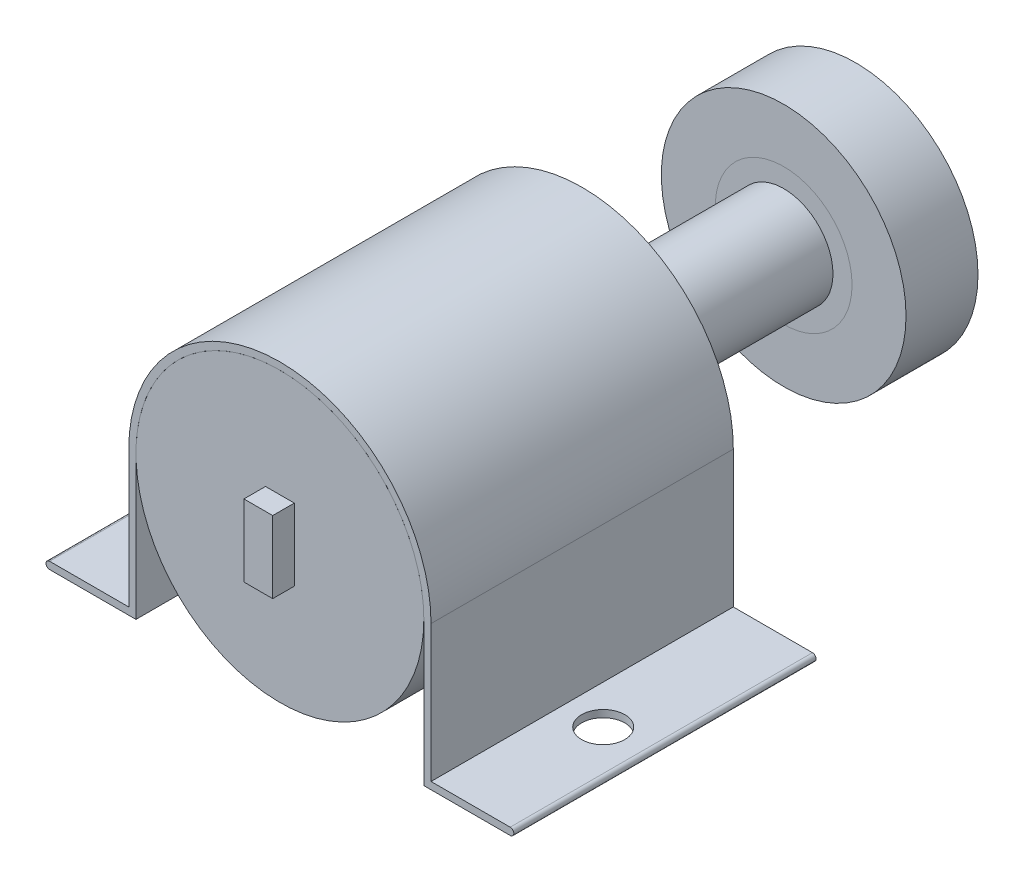
ISO-10303-21;
HEADER;
FILE_DESCRIPTION(('STEP AP214'),'2;1');
FILE_NAME('part.step','',(''),(''),'','','');
FILE_SCHEMA(('AUTOMOTIVE_DESIGN { 1 0 10303 214 1 1 1 1 }'));
ENDSEC;
DATA;
#1=APPLICATION_CONTEXT('core data for automotive mechanical design processes');
#2=APPLICATION_PROTOCOL_DEFINITION('international standard','automotive_design',2000,#1);
#3=PRODUCT_CONTEXT('',#1,'mechanical');
#4=PRODUCT('Part','Part','',(#3));
#5=PRODUCT_RELATED_PRODUCT_CATEGORY('part','',(#4));
#6=PRODUCT_DEFINITION_FORMATION('','',#4);
#7=PRODUCT_DEFINITION_CONTEXT('part definition',#1,'design');
#8=PRODUCT_DEFINITION('design','',#6,#7);
#9=PRODUCT_DEFINITION_SHAPE('','',#8);
#10=(LENGTH_UNIT() NAMED_UNIT(*) SI_UNIT(.MILLI.,.METRE.));
#11=(NAMED_UNIT(*) PLANE_ANGLE_UNIT() SI_UNIT($,.RADIAN.));
#12=(NAMED_UNIT(*) SI_UNIT($,.STERADIAN.) SOLID_ANGLE_UNIT());
#13=UNCERTAINTY_MEASURE_WITH_UNIT(LENGTH_MEASURE(1.E-05),#10,'distance_accuracy_value','');
#14=(GEOMETRIC_REPRESENTATION_CONTEXT(3) GLOBAL_UNCERTAINTY_ASSIGNED_CONTEXT((#13)) GLOBAL_UNIT_ASSIGNED_CONTEXT((#10,
#11,#12)) REPRESENTATION_CONTEXT('',''));
#15=CARTESIAN_POINT('',(0.,0.,0.));
#16=DIRECTION('',(0.,0.,1.));
#17=DIRECTION('',(1.,0.,0.));
#18=AXIS2_PLACEMENT_3D('',#15,#16,#17);
#19=CARTESIAN_POINT('',(0.,52.,-248.));
#20=DIRECTION('',(0.,0.,-1.));
#21=DIRECTION('',(-1.,0.,0.));
#22=AXIS2_PLACEMENT_3D('',#19,#20,#21);
#23=PLANE('',#22);
#24=DIRECTION('',(0.,-1.,0.));
#25=VECTOR('',#24,1.);
#26=CARTESIAN_POINT('',(1.99999999999989,49.5,-248.));
#27=LINE('',#26,#25);
#28=CARTESIAN_POINT('',(1.99999999999989,56.9999999999991,-248.));
#29=VERTEX_POINT('',#28);
#30=CARTESIAN_POINT('',(1.99999999999989,46.9999999999991,-248.));
#31=VERTEX_POINT('',#30);
#32=EDGE_CURVE('P0_E131',#29,#31,#27,.T.);
#33=ORIENTED_EDGE('',*,*,#32,.T.);
#34=DIRECTION('',(-1.,0.,0.));
#35=VECTOR('',#34,1.);
#36=CARTESIAN_POINT('',(-1.00000000000023,46.9999999999991,-248.));
#37=LINE('',#36,#35);
#38=CARTESIAN_POINT('',(-2.00000000000017,46.9999999999991,-248.));
#39=VERTEX_POINT('',#38);
#40=EDGE_CURVE('P0_E114',#31,#39,#37,.T.);
#41=ORIENTED_EDGE('',*,*,#40,.T.);
#42=DIRECTION('',(0.,1.,0.));
#43=VECTOR('',#42,1.);
#44=CARTESIAN_POINT('',(-2.00000000000046,54.5,-248.));
#45=LINE('',#44,#43);
#46=CARTESIAN_POINT('',(-2.00000000000017,56.9999999999991,-248.));
#47=VERTEX_POINT('',#46);
#48=EDGE_CURVE('P0_E140',#39,#47,#45,.T.);
#49=ORIENTED_EDGE('',*,*,#48,.T.);
#50=DIRECTION('',(1.,0.,0.));
#51=VECTOR('',#50,1.);
#52=CARTESIAN_POINT('',(0.999999999999942,56.9999999999991,-248.));
#53=LINE('',#52,#51);
#54=EDGE_CURVE('P0_E75',#47,#29,#53,.T.);
#55=ORIENTED_EDGE('',*,*,#54,.T.);
#56=EDGE_LOOP('',(#33,#41,#49,#55));
#57=FACE_BOUND('',#56,.T.);
#58=CARTESIAN_POINT('',(0.,52.,-248.));
#59=DIRECTION('',(0.,0.,-1.));
#60=DIRECTION('',(-1.,0.,0.));
#61=AXIS2_PLACEMENT_3D('',#58,#59,#60);
#62=CIRCLE('',#61,20.);
#63=CARTESIAN_POINT('',(20.,52.,-248.));
#64=VERTEX_POINT('',#63);
#65=EDGE_CURVE('P0_E11',#64,#64,#62,.T.);
#66=ORIENTED_EDGE('',*,*,#65,.F.);
#67=EDGE_LOOP('',(#66));
#68=FACE_BOUND('',#67,.T.);
#69=ADVANCED_FACE('P0_F17',(#57,#68),#23,.F.);
#70=CARTESIAN_POINT('',(0.,52.,-288.));
#71=DIRECTION('',(0.,0.,-1.));
#72=DIRECTION('',(-1.,0.,0.));
#73=AXIS2_PLACEMENT_3D('',#70,#71,#72);
#74=PLANE('',#73);
#75=CARTESIAN_POINT('',(0.,52.,-288.));
#76=DIRECTION('',(0.,0.,1.));
#77=DIRECTION('',(-1.,0.,0.));
#78=AXIS2_PLACEMENT_3D('',#75,#76,#77);
#79=CIRCLE('',#78,6.85);
#80=CARTESIAN_POINT('',(6.85,52.,-288.));
#81=VERTEX_POINT('',#80);
#82=EDGE_CURVE('P0_E141',#81,#81,#79,.T.);
#83=ORIENTED_EDGE('',*,*,#82,.T.);
#84=EDGE_LOOP('',(#83));
#85=FACE_BOUND('',#84,.T.);
#86=CARTESIAN_POINT('',(0.,52.,-288.));
#87=DIRECTION('',(0.,0.,-1.));
#88=DIRECTION('',(-1.,0.,0.));
#89=AXIS2_PLACEMENT_3D('',#86,#87,#88);
#90=CIRCLE('',#89,20.);
#91=CARTESIAN_POINT('',(20.,52.,-288.));
#92=VERTEX_POINT('',#91);
#93=EDGE_CURVE('P0_E144',#92,#92,#90,.T.);
#94=ORIENTED_EDGE('',*,*,#93,.T.);
#95=EDGE_LOOP('',(#94));
#96=FACE_BOUND('',#95,.T.);
#97=ADVANCED_FACE('P0_F157',(#85,#96),#74,.T.);
#98=CARTESIAN_POINT('',(0.,52.,-248.));
#99=DIRECTION('',(0.,0.,-1.));
#100=DIRECTION('',(-1.,0.,0.));
#101=AXIS2_PLACEMENT_3D('',#98,#99,#100);
#102=CYLINDRICAL_SURFACE('',#101,20.);
#103=ORIENTED_EDGE('',*,*,#93,.F.);
#104=DIRECTION('',(0.,0.,1.));
#105=VECTOR('',#104,1.);
#106=CARTESIAN_POINT('',(20.,52.,-248.));
#107=LINE('',#106,#105);
#108=EDGE_CURVE('P0_E26',#92,#64,#107,.T.);
#109=ORIENTED_EDGE('',*,*,#108,.T.);
#110=ORIENTED_EDGE('',*,*,#65,.T.);
#111=ORIENTED_EDGE('',*,*,#108,.F.);
#112=EDGE_LOOP('',(#103,#109,#110,#111));
#113=FACE_BOUND('',#112,.T.);
#114=ADVANCED_FACE('P0_F19',(#113),#102,.T.);
#115=CARTESIAN_POINT('',(0.,52.,-328.));
#116=DIRECTION('',(0.,0.,-1.));
#117=DIRECTION('',(-1.,0.,0.));
#118=AXIS2_PLACEMENT_3D('',#115,#116,#117);
#119=PLANE('',#118);
#120=CARTESIAN_POINT('',(0.,52.,-328.));
#121=DIRECTION('',(0.,0.,-1.));
#122=DIRECTION('',(-1.,0.,0.));
#123=AXIS2_PLACEMENT_3D('',#120,#121,#122);
#124=CIRCLE('',#123,9.5);
#125=CARTESIAN_POINT('',(9.5,52.,-328.));
#126=VERTEX_POINT('',#125);
#127=EDGE_CURVE('P0_E199',#126,#126,#124,.T.);
#128=ORIENTED_EDGE('',*,*,#127,.T.);
#129=EDGE_LOOP('',(#128));
#130=FACE_BOUND('',#129,.T.);
#131=ADVANCED_FACE('P0_F166',(#130),#119,.T.);
#132=CARTESIAN_POINT('',(0.,52.,-288.));
#133=DIRECTION('',(0.,0.,-1.));
#134=DIRECTION('',(-1.,0.,0.));
#135=AXIS2_PLACEMENT_3D('',#132,#133,#134);
#136=CYLINDRICAL_SURFACE('',#135,6.85);
#137=CARTESIAN_POINT('',(0.,52.,-318.));
#138=DIRECTION('',(0.,0.,1.));
#139=DIRECTION('',(-1.,0.,0.));
#140=AXIS2_PLACEMENT_3D('',#137,#138,#139);
#141=CIRCLE('',#140,6.85);
#142=CARTESIAN_POINT('',(6.85000000000009,52.,-318.));
#143=VERTEX_POINT('',#142);
#144=EDGE_CURVE('P0_E202',#143,#143,#141,.T.);
#145=ORIENTED_EDGE('',*,*,#144,.T.);
#146=DIRECTION('',(0.,0.,1.));
#147=VECTOR('',#146,1.);
#148=CARTESIAN_POINT('',(6.85,52.,-288.));
#149=LINE('',#148,#147);
#150=EDGE_CURVE('P0_E145',#143,#81,#149,.T.);
#151=ORIENTED_EDGE('',*,*,#150,.T.);
#152=ORIENTED_EDGE('',*,*,#82,.F.);
#153=ORIENTED_EDGE('',*,*,#150,.F.);
#154=EDGE_LOOP('',(#145,#151,#152,#153));
#155=FACE_BOUND('',#154,.T.);
#156=ADVANCED_FACE('P0_F186',(#155),#136,.T.);
#157=CARTESIAN_POINT('',(0.,51.9999999999991,-245.));
#158=DIRECTION('',(0.,0.,1.));
#159=DIRECTION('',(1.,0.,0.));
#160=AXIS2_PLACEMENT_3D('',#157,#158,#159);
#161=PLANE('',#160);
#162=DIRECTION('',(-1.,0.,0.));
#163=VECTOR('',#162,1.);
#164=CARTESIAN_POINT('',(-2.00000000000017,56.9999999999991,-245.));
#165=LINE('',#164,#163);
#166=CARTESIAN_POINT('',(1.99999999999989,56.9999999999991,-245.));
#167=VERTEX_POINT('',#166);
#168=CARTESIAN_POINT('',(-2.00000000000017,56.9999999999991,-245.));
#169=VERTEX_POINT('',#168);
#170=EDGE_CURVE('P0_E100',#167,#169,#165,.T.);
#171=ORIENTED_EDGE('',*,*,#170,.T.);
#172=DIRECTION('',(0.,-1.,0.));
#173=VECTOR('',#172,1.);
#174=CARTESIAN_POINT('',(-2.00000000000017,46.9999999999991,-245.));
#175=LINE('',#174,#173);
#176=CARTESIAN_POINT('',(-2.00000000000017,46.9999999999991,-245.));
#177=VERTEX_POINT('',#176);
#178=EDGE_CURVE('P0_E63',#169,#177,#175,.T.);
#179=ORIENTED_EDGE('',*,*,#178,.T.);
#180=DIRECTION('',(1.,0.,0.));
#181=VECTOR('',#180,1.);
#182=CARTESIAN_POINT('',(1.99999999999989,46.9999999999991,-245.));
#183=LINE('',#182,#181);
#184=CARTESIAN_POINT('',(1.99999999999989,46.9999999999991,-245.));
#185=VERTEX_POINT('',#184);
#186=EDGE_CURVE('P0_E104',#177,#185,#183,.T.);
#187=ORIENTED_EDGE('',*,*,#186,.T.);
#188=DIRECTION('',(0.,1.,0.));
#189=VECTOR('',#188,1.);
#190=CARTESIAN_POINT('',(1.99999999999989,56.9999999999991,-245.));
#191=LINE('',#190,#189);
#192=EDGE_CURVE('P0_E108',#185,#167,#191,.T.);
#193=ORIENTED_EDGE('',*,*,#192,.T.);
#194=EDGE_LOOP('',(#171,#179,#187,#193));
#195=FACE_BOUND('',#194,.T.);
#196=ADVANCED_FACE('P0_F106',(#195),#161,.T.);
#197=CARTESIAN_POINT('',(1.99999999999989,56.9999999999991,-248.));
#198=DIRECTION('',(0.,1.,0.));
#199=DIRECTION('',(1.,0.,0.));
#200=AXIS2_PLACEMENT_3D('',#197,#198,#199);
#201=PLANE('',#200);
#202=ORIENTED_EDGE('',*,*,#54,.F.);
#203=DIRECTION('',(0.,0.,1.));
#204=VECTOR('',#203,1.);
#205=CARTESIAN_POINT('',(-2.00000000000017,56.9999999999991,-248.));
#206=LINE('',#205,#204);
#207=EDGE_CURVE('P0_E136',#47,#169,#206,.T.);
#208=ORIENTED_EDGE('',*,*,#207,.T.);
#209=ORIENTED_EDGE('',*,*,#170,.F.);
#210=DIRECTION('',(0.,0.,1.));
#211=VECTOR('',#210,1.);
#212=CARTESIAN_POINT('',(1.99999999999989,56.9999999999991,-248.));
#213=LINE('',#212,#211);
#214=EDGE_CURVE('P0_E126',#29,#167,#213,.T.);
#215=ORIENTED_EDGE('',*,*,#214,.F.);
#216=EDGE_LOOP('',(#202,#208,#209,#215));
#217=FACE_BOUND('',#216,.T.);
#218=ADVANCED_FACE('P0_F170',(#217),#201,.T.);
#219=CARTESIAN_POINT('',(-2.00000000000017,56.9999999999991,-248.));
#220=DIRECTION('',(-1.,0.,0.));
#221=DIRECTION('',(0.,1.,0.));
#222=AXIS2_PLACEMENT_3D('',#219,#220,#221);
#223=PLANE('',#222);
#224=ORIENTED_EDGE('',*,*,#48,.F.);
#225=DIRECTION('',(0.,0.,1.));
#226=VECTOR('',#225,1.);
#227=CARTESIAN_POINT('',(-2.00000000000017,46.9999999999991,-248.));
#228=LINE('',#227,#226);
#229=EDGE_CURVE('P0_E113',#39,#177,#228,.T.);
#230=ORIENTED_EDGE('',*,*,#229,.T.);
#231=ORIENTED_EDGE('',*,*,#178,.F.);
#232=ORIENTED_EDGE('',*,*,#207,.F.);
#233=EDGE_LOOP('',(#224,#230,#231,#232));
#234=FACE_BOUND('',#233,.T.);
#235=ADVANCED_FACE('P0_F173',(#234),#223,.T.);
#236=CARTESIAN_POINT('',(-2.00000000000017,46.9999999999991,-248.));
#237=DIRECTION('',(0.,-1.,0.));
#238=DIRECTION('',(-1.,0.,0.));
#239=AXIS2_PLACEMENT_3D('',#236,#237,#238);
#240=PLANE('',#239);
#241=ORIENTED_EDGE('',*,*,#40,.F.);
#242=DIRECTION('',(0.,0.,1.));
#243=VECTOR('',#242,1.);
#244=CARTESIAN_POINT('',(1.99999999999989,46.9999999999991,-248.));
#245=LINE('',#244,#243);
#246=EDGE_CURVE('P0_E117',#31,#185,#245,.T.);
#247=ORIENTED_EDGE('',*,*,#246,.T.);
#248=ORIENTED_EDGE('',*,*,#186,.F.);
#249=ORIENTED_EDGE('',*,*,#229,.F.);
#250=EDGE_LOOP('',(#241,#247,#248,#249));
#251=FACE_BOUND('',#250,.T.);
#252=ADVANCED_FACE('P0_F118',(#251),#240,.T.);
#253=CARTESIAN_POINT('',(1.99999999999989,46.9999999999991,-248.));
#254=DIRECTION('',(1.,0.,0.));
#255=DIRECTION('',(0.,0.,-1.));
#256=AXIS2_PLACEMENT_3D('',#253,#254,#255);
#257=PLANE('',#256);
#258=ORIENTED_EDGE('',*,*,#32,.F.);
#259=ORIENTED_EDGE('',*,*,#214,.T.);
#260=ORIENTED_EDGE('',*,*,#192,.F.);
#261=ORIENTED_EDGE('',*,*,#246,.F.);
#262=EDGE_LOOP('',(#258,#259,#260,#261));
#263=FACE_BOUND('',#262,.T.);
#264=ADVANCED_FACE('P0_F125',(#263),#257,.T.);
#265=CARTESIAN_POINT('',(0.,52.,-318.));
#266=DIRECTION('',(0.,0.,-1.));
#267=DIRECTION('',(0.,-1.,0.));
#268=AXIS2_PLACEMENT_3D('',#265,#266,#267);
#269=PLANE('',#268);
#270=ORIENTED_EDGE('',*,*,#144,.F.);
#271=EDGE_LOOP('',(#270));
#272=FACE_BOUND('',#271,.T.);
#273=CARTESIAN_POINT('',(0.,52.,-318.));
#274=DIRECTION('',(0.,0.,1.));
#275=DIRECTION('',(-1.,0.,0.));
#276=AXIS2_PLACEMENT_3D('',#273,#274,#275);
#277=CIRCLE('',#276,9.5);
#278=CARTESIAN_POINT('',(9.5,52.,-318.));
#279=VERTEX_POINT('',#278);
#280=EDGE_CURVE('P0_E211',#279,#279,#277,.T.);
#281=ORIENTED_EDGE('',*,*,#280,.T.);
#282=EDGE_LOOP('',(#281));
#283=FACE_BOUND('',#282,.T.);
#284=ADVANCED_FACE('P0_F176',(#272,#283),#269,.F.);
#285=CARTESIAN_POINT('',(0.,52.,-328.));
#286=DIRECTION('',(0.,0.,1.));
#287=DIRECTION('',(-1.,0.,0.));
#288=AXIS2_PLACEMENT_3D('',#285,#286,#287);
#289=CYLINDRICAL_SURFACE('',#288,9.5);
#290=ORIENTED_EDGE('',*,*,#280,.F.);
#291=DIRECTION('',(0.,0.,-1.));
#292=VECTOR('',#291,1.);
#293=CARTESIAN_POINT('',(9.5,52.,-328.));
#294=LINE('',#293,#292);
#295=EDGE_CURVE('P0_E203',#279,#126,#294,.T.);
#296=ORIENTED_EDGE('',*,*,#295,.T.);
#297=ORIENTED_EDGE('',*,*,#127,.F.);
#298=ORIENTED_EDGE('',*,*,#295,.F.);
#299=EDGE_LOOP('',(#290,#296,#297,#298));
#300=FACE_BOUND('',#299,.T.);
#301=ADVANCED_FACE('P0_F174',(#300),#289,.T.);
#302=CLOSED_SHELL('',(#69,#97,#114,#131,#156,#196,#218,#235,#252,#264,#284,#301));
#303=MANIFOLD_SOLID_BREP('P0_B1',#302);
#304=CARTESIAN_POINT('',(1.43662859386495E-13,52.,-318.));
#305=DIRECTION('',(0.,0.,-1.));
#306=DIRECTION('',(0.,-1.,0.));
#307=AXIS2_PLACEMENT_3D('',#304,#305,#306);
#308=PLANE('',#307);
#309=CARTESIAN_POINT('',(1.43662859386495E-13,52.,-318.));
#310=DIRECTION('',(0.,0.,-1.));
#311=DIRECTION('',(-1.,0.,0.));
#312=AXIS2_PLACEMENT_3D('',#309,#310,#311);
#313=CIRCLE('',#312,9.5);
#314=CARTESIAN_POINT('',(9.50000000000015,52.,-318.));
#315=VERTEX_POINT('',#314);
#316=EDGE_CURVE('P1_E57',#315,#315,#313,.T.);
#317=ORIENTED_EDGE('',*,*,#316,.T.);
#318=EDGE_LOOP('',(#317));
#319=FACE_BOUND('',#318,.T.);
#320=CARTESIAN_POINT('',(1.43662859386495E-13,52.,-318.));
#321=DIRECTION('',(0.,0.,1.));
#322=DIRECTION('',(-1.,0.,0.));
#323=AXIS2_PLACEMENT_3D('',#320,#321,#322);
#324=CIRCLE('',#323,17.0000000646859);
#325=CARTESIAN_POINT('',(17.0000000646861,52.,-318.));
#326=VERTEX_POINT('',#325);
#327=EDGE_CURVE('P1_E67',#326,#326,#324,.T.);
#328=ORIENTED_EDGE('',*,*,#327,.T.);
#329=EDGE_LOOP('',(#328));
#330=FACE_BOUND('',#329,.T.);
#331=ADVANCED_FACE('P1_F17',(#319,#330),#308,.F.);
#332=CARTESIAN_POINT('',(1.43662859386495E-13,52.,-328.));
#333=DIRECTION('',(0.,0.,-1.));
#334=DIRECTION('',(0.,-1.,0.));
#335=AXIS2_PLACEMENT_3D('',#332,#333,#334);
#336=PLANE('',#335);
#337=CARTESIAN_POINT('',(1.43662859386495E-13,52.,-328.));
#338=DIRECTION('',(0.,0.,1.));
#339=DIRECTION('',(-1.,0.,0.));
#340=AXIS2_PLACEMENT_3D('',#337,#338,#339);
#341=CIRCLE('',#340,9.5);
#342=CARTESIAN_POINT('',(9.50000000000015,52.,-328.));
#343=VERTEX_POINT('',#342);
#344=EDGE_CURVE('P1_E56',#343,#343,#341,.T.);
#345=ORIENTED_EDGE('',*,*,#344,.T.);
#346=EDGE_LOOP('',(#345));
#347=FACE_BOUND('',#346,.T.);
#348=CARTESIAN_POINT('',(1.43662859386495E-13,52.,-328.));
#349=DIRECTION('',(0.,0.,-1.));
#350=DIRECTION('',(-1.,0.,0.));
#351=AXIS2_PLACEMENT_3D('',#348,#349,#350);
#352=CIRCLE('',#351,17.0000000646859);
#353=CARTESIAN_POINT('',(17.0000000646861,52.,-328.));
#354=VERTEX_POINT('',#353);
#355=EDGE_CURVE('P1_E11',#354,#354,#352,.T.);
#356=ORIENTED_EDGE('',*,*,#355,.T.);
#357=EDGE_LOOP('',(#356));
#358=FACE_BOUND('',#357,.T.);
#359=ADVANCED_FACE('P1_F61',(#347,#358),#336,.T.);
#360=CARTESIAN_POINT('',(1.43662859386495E-13,52.,-328.));
#361=DIRECTION('',(0.,0.,1.));
#362=DIRECTION('',(-1.,0.,0.));
#363=AXIS2_PLACEMENT_3D('',#360,#361,#362);
#364=CYLINDRICAL_SURFACE('',#363,17.0000000646859);
#365=ORIENTED_EDGE('',*,*,#327,.F.);
#366=DIRECTION('',(0.,0.,-1.));
#367=VECTOR('',#366,1.);
#368=CARTESIAN_POINT('',(17.000000064686,52.,-328.));
#369=LINE('',#368,#367);
#370=EDGE_CURVE('P1_E25',#326,#354,#369,.T.);
#371=ORIENTED_EDGE('',*,*,#370,.T.);
#372=ORIENTED_EDGE('',*,*,#355,.F.);
#373=ORIENTED_EDGE('',*,*,#370,.F.);
#374=EDGE_LOOP('',(#365,#371,#372,#373));
#375=FACE_BOUND('',#374,.T.);
#376=ADVANCED_FACE('P1_F74',(#375),#364,.T.);
#377=CARTESIAN_POINT('',(1.43662859386495E-13,52.,-328.));
#378=DIRECTION('',(0.,0.,1.));
#379=DIRECTION('',(-1.,0.,0.));
#380=AXIS2_PLACEMENT_3D('',#377,#378,#379);
#381=CYLINDRICAL_SURFACE('',#380,9.5);
#382=ORIENTED_EDGE('',*,*,#344,.F.);
#383=DIRECTION('',(0.,0.,1.));
#384=VECTOR('',#383,1.);
#385=CARTESIAN_POINT('',(9.50000000000014,52.,-328.));
#386=LINE('',#385,#384);
#387=EDGE_CURVE('P1_E53',#343,#315,#386,.T.);
#388=ORIENTED_EDGE('',*,*,#387,.T.);
#389=ORIENTED_EDGE('',*,*,#316,.F.);
#390=ORIENTED_EDGE('',*,*,#387,.F.);
#391=EDGE_LOOP('',(#382,#388,#389,#390));
#392=FACE_BOUND('',#391,.T.);
#393=ADVANCED_FACE('P1_F55',(#392),#381,.F.);
#394=CLOSED_SHELL('',(#331,#359,#376,#393));
#395=MANIFOLD_SOLID_BREP('P1_B1',#394);
#396=CARTESIAN_POINT('',(0.,52.5,-290.));
#397=DIRECTION('',(0.,0.,1.));
#398=DIRECTION('',(1.,0.,0.));
#399=AXIS2_PLACEMENT_3D('',#396,#397,#398);
#400=PLANE('',#399);
#401=DIRECTION('',(-1.,0.,0.));
#402=VECTOR('',#401,1.);
#403=CARTESIAN_POINT('',(20.,32.,-290.));
#404=LINE('',#403,#402);
#405=CARTESIAN_POINT('',(32.,32.,-290.));
#406=VERTEX_POINT('',#405);
#407=CARTESIAN_POINT('',(20.,32.,-290.));
#408=VERTEX_POINT('',#407);
#409=EDGE_CURVE('P2_E11',#406,#408,#404,.T.);
#410=ORIENTED_EDGE('',*,*,#409,.T.);
#411=DIRECTION('',(0.,1.,0.));
#412=VECTOR('',#411,1.);
#413=CARTESIAN_POINT('',(20.,52.,-290.));
#414=LINE('',#413,#412);
#415=CARTESIAN_POINT('',(20.,52.,-290.));
#416=VERTEX_POINT('',#415);
#417=EDGE_CURVE('P2_E282',#408,#416,#414,.T.);
#418=ORIENTED_EDGE('',*,*,#417,.T.);
#419=CARTESIAN_POINT('',(0.,52.,-290.));
#420=DIRECTION('',(0.,0.,1.));
#421=DIRECTION('',(0.,1.,0.));
#422=AXIS2_PLACEMENT_3D('',#419,#420,#421);
#423=CIRCLE('',#422,20.);
#424=CARTESIAN_POINT('',(-20.,52.,-290.));
#425=VERTEX_POINT('',#424);
#426=EDGE_CURVE('P2_E224',#416,#425,#423,.T.);
#427=ORIENTED_EDGE('',*,*,#426,.T.);
#428=DIRECTION('',(0.,-1.,0.));
#429=VECTOR('',#428,1.);
#430=CARTESIAN_POINT('',(-20.,52.,-290.));
#431=LINE('',#430,#429);
#432=CARTESIAN_POINT('',(-20.,32.,-290.));
#433=VERTEX_POINT('',#432);
#434=EDGE_CURVE('P2_E273',#425,#433,#431,.T.);
#435=ORIENTED_EDGE('',*,*,#434,.T.);
#436=DIRECTION('',(-1.,0.,0.));
#437=VECTOR('',#436,1.);
#438=CARTESIAN_POINT('',(-20.,32.,-290.));
#439=LINE('',#438,#437);
#440=CARTESIAN_POINT('',(-32.,32.,-290.));
#441=VERTEX_POINT('',#440);
#442=EDGE_CURVE('P2_E243',#433,#441,#439,.T.);
#443=ORIENTED_EDGE('',*,*,#442,.T.);
#444=CARTESIAN_POINT('',(-32.,32.5,-290.));
#445=DIRECTION('',(0.,0.,-1.));
#446=DIRECTION('',(0.,1.,0.));
#447=AXIS2_PLACEMENT_3D('',#444,#445,#446);
#448=CIRCLE('',#447,0.5);
#449=CARTESIAN_POINT('',(-32.,33.,-290.));
#450=VERTEX_POINT('',#449);
#451=EDGE_CURVE('P2_E259',#441,#450,#448,.T.);
#452=ORIENTED_EDGE('',*,*,#451,.T.);
#453=DIRECTION('',(1.,0.,0.));
#454=VECTOR('',#453,1.);
#455=CARTESIAN_POINT('',(-21.,33.,-290.));
#456=LINE('',#455,#454);
#457=CARTESIAN_POINT('',(-21.,33.,-290.));
#458=VERTEX_POINT('',#457);
#459=EDGE_CURVE('P2_E248',#450,#458,#456,.T.);
#460=ORIENTED_EDGE('',*,*,#459,.T.);
#461=DIRECTION('',(0.,1.,0.));
#462=VECTOR('',#461,1.);
#463=CARTESIAN_POINT('',(-21.,52.,-290.));
#464=LINE('',#463,#462);
#465=CARTESIAN_POINT('',(-21.,52.,-290.));
#466=VERTEX_POINT('',#465);
#467=EDGE_CURVE('P2_E232',#458,#466,#464,.T.);
#468=ORIENTED_EDGE('',*,*,#467,.T.);
#469=CARTESIAN_POINT('',(0.,52.,-290.));
#470=DIRECTION('',(0.,0.,-1.));
#471=DIRECTION('',(1.,0.,0.));
#472=AXIS2_PLACEMENT_3D('',#469,#470,#471);
#473=CIRCLE('',#472,21.);
#474=CARTESIAN_POINT('',(21.,52.,-290.));
#475=VERTEX_POINT('',#474);
#476=EDGE_CURVE('P2_E211',#466,#475,#473,.T.);
#477=ORIENTED_EDGE('',*,*,#476,.T.);
#478=DIRECTION('',(0.,-1.,0.));
#479=VECTOR('',#478,1.);
#480=CARTESIAN_POINT('',(21.,52.,-290.));
#481=LINE('',#480,#479);
#482=CARTESIAN_POINT('',(21.,33.,-290.));
#483=VERTEX_POINT('',#482);
#484=EDGE_CURVE('P2_E197',#475,#483,#481,.T.);
#485=ORIENTED_EDGE('',*,*,#484,.T.);
#486=DIRECTION('',(1.,0.,0.));
#487=VECTOR('',#486,1.);
#488=CARTESIAN_POINT('',(21.,33.,-290.));
#489=LINE('',#488,#487);
#490=CARTESIAN_POINT('',(32.,33.,-290.));
#491=VERTEX_POINT('',#490);
#492=EDGE_CURVE('P2_E164',#483,#491,#489,.T.);
#493=ORIENTED_EDGE('',*,*,#492,.T.);
#494=CARTESIAN_POINT('',(32.,32.5,-290.));
#495=DIRECTION('',(0.,0.,-1.));
#496=DIRECTION('',(0.,-1.,0.));
#497=AXIS2_PLACEMENT_3D('',#494,#495,#496);
#498=CIRCLE('',#497,0.5);
#499=EDGE_CURVE('P2_E171',#491,#406,#498,.T.);
#500=ORIENTED_EDGE('',*,*,#499,.T.);
#501=EDGE_LOOP('',(#410,#418,#427,#435,#443,#452,#460,#468,#477,#485,#493,#500));
#502=FACE_BOUND('',#501,.T.);
#503=ADVANCED_FACE('P2_F17',(#502),#400,.F.);
#504=CARTESIAN_POINT('',(0.,52.5,-248.));
#505=DIRECTION('',(0.,0.,1.));
#506=DIRECTION('',(1.,0.,0.));
#507=AXIS2_PLACEMENT_3D('',#504,#505,#506);
#508=PLANE('',#507);
#509=DIRECTION('',(1.,0.,0.));
#510=VECTOR('',#509,1.);
#511=CARTESIAN_POINT('',(20.,32.,-248.));
#512=LINE('',#511,#510);
#513=CARTESIAN_POINT('',(20.,32.,-248.));
#514=VERTEX_POINT('',#513);
#515=CARTESIAN_POINT('',(32.,32.,-248.));
#516=VERTEX_POINT('',#515);
#517=EDGE_CURVE('P2_E21',#514,#516,#512,.T.);
#518=ORIENTED_EDGE('',*,*,#517,.T.);
#519=CARTESIAN_POINT('',(32.,32.5,-248.));
#520=DIRECTION('',(0.,0.,1.));
#521=DIRECTION('',(0.,-1.,0.));
#522=AXIS2_PLACEMENT_3D('',#519,#520,#521);
#523=CIRCLE('',#522,0.5);
#524=CARTESIAN_POINT('',(32.,33.,-248.));
#525=VERTEX_POINT('',#524);
#526=EDGE_CURVE('P2_E170',#516,#525,#523,.T.);
#527=ORIENTED_EDGE('',*,*,#526,.T.);
#528=DIRECTION('',(1.,0.,0.));
#529=VECTOR('',#528,1.);
#530=CARTESIAN_POINT('',(21.,33.,-248.));
#531=LINE('',#530,#529);
#532=CARTESIAN_POINT('',(21.,33.,-248.));
#533=VERTEX_POINT('',#532);
#534=EDGE_CURVE('P2_E152',#533,#525,#531,.T.);
#535=ORIENTED_EDGE('',*,*,#534,.F.);
#536=DIRECTION('',(0.,-1.,0.));
#537=VECTOR('',#536,1.);
#538=CARTESIAN_POINT('',(21.,52.,-248.));
#539=LINE('',#538,#537);
#540=CARTESIAN_POINT('',(21.,52.,-248.));
#541=VERTEX_POINT('',#540);
#542=EDGE_CURVE('P2_E201',#541,#533,#539,.T.);
#543=ORIENTED_EDGE('',*,*,#542,.F.);
#544=CARTESIAN_POINT('',(0.,52.,-248.));
#545=DIRECTION('',(0.,0.,1.));
#546=DIRECTION('',(1.,0.,0.));
#547=AXIS2_PLACEMENT_3D('',#544,#545,#546);
#548=CIRCLE('',#547,21.);
#549=CARTESIAN_POINT('',(-21.,52.,-248.));
#550=VERTEX_POINT('',#549);
#551=EDGE_CURVE('P2_E207',#541,#550,#548,.T.);
#552=ORIENTED_EDGE('',*,*,#551,.T.);
#553=DIRECTION('',(0.,-1.,0.));
#554=VECTOR('',#553,1.);
#555=CARTESIAN_POINT('',(-21.,52.,-248.));
#556=LINE('',#555,#554);
#557=CARTESIAN_POINT('',(-21.,33.,-248.));
#558=VERTEX_POINT('',#557);
#559=EDGE_CURVE('P2_E218',#550,#558,#556,.T.);
#560=ORIENTED_EDGE('',*,*,#559,.T.);
#561=DIRECTION('',(-1.,0.,0.));
#562=VECTOR('',#561,1.);
#563=CARTESIAN_POINT('',(-21.,33.,-248.));
#564=LINE('',#563,#562);
#565=CARTESIAN_POINT('',(-32.,33.,-248.));
#566=VERTEX_POINT('',#565);
#567=EDGE_CURVE('P2_E239',#558,#566,#564,.T.);
#568=ORIENTED_EDGE('',*,*,#567,.T.);
#569=CARTESIAN_POINT('',(-32.,32.5,-248.));
#570=DIRECTION('',(0.,0.,1.));
#571=DIRECTION('',(0.,1.,0.));
#572=AXIS2_PLACEMENT_3D('',#569,#570,#571);
#573=CIRCLE('',#572,0.5);
#574=CARTESIAN_POINT('',(-32.,32.,-248.));
#575=VERTEX_POINT('',#574);
#576=EDGE_CURVE('P2_E255',#566,#575,#573,.T.);
#577=ORIENTED_EDGE('',*,*,#576,.T.);
#578=DIRECTION('',(-1.,0.,0.));
#579=VECTOR('',#578,1.);
#580=CARTESIAN_POINT('',(-20.,32.,-248.));
#581=LINE('',#580,#579);
#582=CARTESIAN_POINT('',(-20.,32.,-248.));
#583=VERTEX_POINT('',#582);
#584=EDGE_CURVE('P2_E240',#583,#575,#581,.T.);
#585=ORIENTED_EDGE('',*,*,#584,.F.);
#586=DIRECTION('',(0.,-1.,0.));
#587=VECTOR('',#586,1.);
#588=CARTESIAN_POINT('',(-20.,52.,-248.));
#589=LINE('',#588,#587);
#590=CARTESIAN_POINT('',(-20.,52.,-248.));
#591=VERTEX_POINT('',#590);
#592=EDGE_CURVE('P2_E271',#591,#583,#589,.T.);
#593=ORIENTED_EDGE('',*,*,#592,.F.);
#594=CARTESIAN_POINT('',(0.,52.,-248.));
#595=DIRECTION('',(0.,0.,1.));
#596=DIRECTION('',(0.,1.,0.));
#597=AXIS2_PLACEMENT_3D('',#594,#595,#596);
#598=CIRCLE('',#597,20.);
#599=CARTESIAN_POINT('',(20.,52.,-248.));
#600=VERTEX_POINT('',#599);
#601=EDGE_CURVE('P2_E225',#600,#591,#598,.T.);
#602=ORIENTED_EDGE('',*,*,#601,.F.);
#603=DIRECTION('',(0.,-1.,0.));
#604=VECTOR('',#603,1.);
#605=CARTESIAN_POINT('',(20.,52.,-248.));
#606=LINE('',#605,#604);
#607=EDGE_CURVE('P2_E223',#600,#514,#606,.T.);
#608=ORIENTED_EDGE('',*,*,#607,.T.);
#609=EDGE_LOOP('',(#518,#527,#535,#543,#552,#560,#568,#577,#585,#593,#602,#608));
#610=FACE_BOUND('',#609,.T.);
#611=ADVANCED_FACE('P2_F19',(#610),#508,.T.);
#612=CARTESIAN_POINT('',(32.,32.,-248.));
#613=DIRECTION('',(0.,-1.,0.));
#614=DIRECTION('',(0.,0.,-1.));
#615=AXIS2_PLACEMENT_3D('',#612,#613,#614);
#616=PLANE('',#615);
#617=CARTESIAN_POINT('',(26.4172506400407,32.,-266.50693700889));
#618=DIRECTION('',(0.,1.,0.));
#619=DIRECTION('',(0.,0.,1.));
#620=AXIS2_PLACEMENT_3D('',#617,#618,#619);
#621=CIRCLE('',#620,3.);
#622=CARTESIAN_POINT('',(26.4172506400407,32.,-269.50693700889));
#623=VERTEX_POINT('',#622);
#624=EDGE_CURVE('P2_E177',#623,#623,#621,.T.);
#625=ORIENTED_EDGE('',*,*,#624,.T.);
#626=EDGE_LOOP('',(#625));
#627=FACE_BOUND('',#626,.T.);
#628=ORIENTED_EDGE('',*,*,#517,.F.);
#629=DIRECTION('',(0.,0.,-1.));
#630=VECTOR('',#629,1.);
#631=CARTESIAN_POINT('',(20.,32.,-248.));
#632=LINE('',#631,#630);
#633=EDGE_CURVE('P2_E284',#514,#408,#632,.T.);
#634=ORIENTED_EDGE('',*,*,#633,.T.);
#635=ORIENTED_EDGE('',*,*,#409,.F.);
#636=DIRECTION('',(0.,0.,-1.));
#637=VECTOR('',#636,1.);
#638=CARTESIAN_POINT('',(32.,32.,-248.));
#639=LINE('',#638,#637);
#640=EDGE_CURVE('P2_E176',#516,#406,#639,.T.);
#641=ORIENTED_EDGE('',*,*,#640,.F.);
#642=EDGE_LOOP('',(#628,#634,#635,#641));
#643=FACE_BOUND('',#642,.T.);
#644=ADVANCED_FACE('P2_F404',(#627,#643),#616,.T.);
#645=CARTESIAN_POINT('',(20.,32.,-248.));
#646=DIRECTION('',(-1.,0.,0.));
#647=DIRECTION('',(0.,0.,1.));
#648=AXIS2_PLACEMENT_3D('',#645,#646,#647);
#649=PLANE('',#648);
#650=ORIENTED_EDGE('',*,*,#607,.F.);
#651=DIRECTION('',(0.,0.,-1.));
#652=VECTOR('',#651,1.);
#653=CARTESIAN_POINT('',(20.,52.,-248.));
#654=LINE('',#653,#652);
#655=EDGE_CURVE('P2_E219',#600,#416,#654,.T.);
#656=ORIENTED_EDGE('',*,*,#655,.T.);
#657=ORIENTED_EDGE('',*,*,#417,.F.);
#658=ORIENTED_EDGE('',*,*,#633,.F.);
#659=EDGE_LOOP('',(#650,#656,#657,#658));
#660=FACE_BOUND('',#659,.T.);
#661=ADVANCED_FACE('P2_F395',(#660),#649,.T.);
#662=CARTESIAN_POINT('',(0.,52.,-248.));
#663=DIRECTION('',(0.,0.,-1.));
#664=DIRECTION('',(0.,1.,0.));
#665=AXIS2_PLACEMENT_3D('',#662,#663,#664);
#666=CYLINDRICAL_SURFACE('',#665,20.);
#667=ORIENTED_EDGE('',*,*,#601,.T.);
#668=DIRECTION('',(0.,0.,-1.));
#669=VECTOR('',#668,1.);
#670=CARTESIAN_POINT('',(-20.,52.,-248.));
#671=LINE('',#670,#669);
#672=EDGE_CURVE('P2_E228',#591,#425,#671,.T.);
#673=ORIENTED_EDGE('',*,*,#672,.T.);
#674=ORIENTED_EDGE('',*,*,#426,.F.);
#675=ORIENTED_EDGE('',*,*,#655,.F.);
#676=EDGE_LOOP('',(#667,#673,#674,#675));
#677=FACE_BOUND('',#676,.T.);
#678=ADVANCED_FACE('P2_F386',(#677),#666,.F.);
#679=CARTESIAN_POINT('',(-20.,52.,-248.));
#680=DIRECTION('',(1.,0.,0.));
#681=DIRECTION('',(0.,1.,0.));
#682=AXIS2_PLACEMENT_3D('',#679,#680,#681);
#683=PLANE('',#682);
#684=ORIENTED_EDGE('',*,*,#592,.T.);
#685=DIRECTION('',(0.,0.,-1.));
#686=VECTOR('',#685,1.);
#687=CARTESIAN_POINT('',(-20.,32.,-248.));
#688=LINE('',#687,#686);
#689=EDGE_CURVE('P2_E267',#583,#433,#688,.T.);
#690=ORIENTED_EDGE('',*,*,#689,.T.);
#691=ORIENTED_EDGE('',*,*,#434,.F.);
#692=ORIENTED_EDGE('',*,*,#672,.F.);
#693=EDGE_LOOP('',(#684,#690,#691,#692));
#694=FACE_BOUND('',#693,.T.);
#695=ADVANCED_FACE('P2_F335',(#694),#683,.T.);
#696=CARTESIAN_POINT('',(-20.,32.,-248.));
#697=DIRECTION('',(0.,-1.,0.));
#698=DIRECTION('',(0.,0.,-1.));
#699=AXIS2_PLACEMENT_3D('',#696,#697,#698);
#700=PLANE('',#699);
#701=CARTESIAN_POINT('',(-26.4172506400407,32.,-266.50693700889));
#702=DIRECTION('',(0.,1.,0.));
#703=DIRECTION('',(0.,0.,1.));
#704=AXIS2_PLACEMENT_3D('',#701,#702,#703);
#705=CIRCLE('',#704,3.);
#706=CARTESIAN_POINT('',(-26.4172506400407,32.,-269.50693700889));
#707=VERTEX_POINT('',#706);
#708=EDGE_CURVE('P2_E463',#707,#707,#705,.T.);
#709=ORIENTED_EDGE('',*,*,#708,.T.);
#710=EDGE_LOOP('',(#709));
#711=FACE_BOUND('',#710,.T.);
#712=ORIENTED_EDGE('',*,*,#584,.T.);
#713=DIRECTION('',(0.,0.,-1.));
#714=VECTOR('',#713,1.);
#715=CARTESIAN_POINT('',(-32.,32.,-248.));
#716=LINE('',#715,#714);
#717=EDGE_CURVE('P2_E244',#575,#441,#716,.T.);
#718=ORIENTED_EDGE('',*,*,#717,.T.);
#719=ORIENTED_EDGE('',*,*,#442,.F.);
#720=ORIENTED_EDGE('',*,*,#689,.F.);
#721=EDGE_LOOP('',(#712,#718,#719,#720));
#722=FACE_BOUND('',#721,.T.);
#723=ADVANCED_FACE('P2_F329',(#711,#722),#700,.T.);
#724=CARTESIAN_POINT('',(-32.,32.5,-248.));
#725=DIRECTION('',(0.,0.,-1.));
#726=DIRECTION('',(0.,1.,0.));
#727=AXIS2_PLACEMENT_3D('',#724,#725,#726);
#728=CYLINDRICAL_SURFACE('',#727,0.5);
#729=ORIENTED_EDGE('',*,*,#576,.F.);
#730=DIRECTION('',(0.,0.,-1.));
#731=VECTOR('',#730,1.);
#732=CARTESIAN_POINT('',(-32.,33.,-248.));
#733=LINE('',#732,#731);
#734=EDGE_CURVE('P2_E251',#566,#450,#733,.T.);
#735=ORIENTED_EDGE('',*,*,#734,.T.);
#736=ORIENTED_EDGE('',*,*,#451,.F.);
#737=ORIENTED_EDGE('',*,*,#717,.F.);
#738=EDGE_LOOP('',(#729,#735,#736,#737));
#739=FACE_BOUND('',#738,.T.);
#740=ADVANCED_FACE('P2_F334',(#739),#728,.T.);
#741=CARTESIAN_POINT('',(-32.,33.,-248.));
#742=DIRECTION('',(0.,1.,0.));
#743=DIRECTION('',(1.,0.,0.));
#744=AXIS2_PLACEMENT_3D('',#741,#742,#743);
#745=PLANE('',#744);
#746=CARTESIAN_POINT('',(-26.4172506400407,33.,-266.50693700889));
#747=DIRECTION('',(0.,-1.,0.));
#748=DIRECTION('',(0.,0.,1.));
#749=AXIS2_PLACEMENT_3D('',#746,#747,#748);
#750=CIRCLE('',#749,3.);
#751=CARTESIAN_POINT('',(-26.4172506400407,33.,-269.50693700889));
#752=VERTEX_POINT('',#751);
#753=EDGE_CURVE('P2_E451',#752,#752,#750,.T.);
#754=ORIENTED_EDGE('',*,*,#753,.T.);
#755=EDGE_LOOP('',(#754));
#756=FACE_BOUND('',#755,.T.);
#757=ORIENTED_EDGE('',*,*,#567,.F.);
#758=DIRECTION('',(0.,0.,-1.));
#759=VECTOR('',#758,1.);
#760=CARTESIAN_POINT('',(-21.,33.,-248.));
#761=LINE('',#760,#759);
#762=EDGE_CURVE('P2_E235',#558,#458,#761,.T.);
#763=ORIENTED_EDGE('',*,*,#762,.T.);
#764=ORIENTED_EDGE('',*,*,#459,.F.);
#765=ORIENTED_EDGE('',*,*,#734,.F.);
#766=EDGE_LOOP('',(#757,#763,#764,#765));
#767=FACE_BOUND('',#766,.T.);
#768=ADVANCED_FACE('P2_F363',(#756,#767),#745,.T.);
#769=CARTESIAN_POINT('',(-21.,33.,-248.));
#770=DIRECTION('',(-1.,0.,0.));
#771=DIRECTION('',(0.,0.,1.));
#772=AXIS2_PLACEMENT_3D('',#769,#770,#771);
#773=PLANE('',#772);
#774=ORIENTED_EDGE('',*,*,#559,.F.);
#775=DIRECTION('',(0.,0.,-1.));
#776=VECTOR('',#775,1.);
#777=CARTESIAN_POINT('',(-21.,52.,-248.));
#778=LINE('',#777,#776);
#779=EDGE_CURVE('P2_E214',#550,#466,#778,.T.);
#780=ORIENTED_EDGE('',*,*,#779,.T.);
#781=ORIENTED_EDGE('',*,*,#467,.F.);
#782=ORIENTED_EDGE('',*,*,#762,.F.);
#783=EDGE_LOOP('',(#774,#780,#781,#782));
#784=FACE_BOUND('',#783,.T.);
#785=ADVANCED_FACE('P2_F354',(#784),#773,.T.);
#786=CARTESIAN_POINT('',(0.,52.,-248.));
#787=DIRECTION('',(0.,0.,-1.));
#788=DIRECTION('',(1.,0.,0.));
#789=AXIS2_PLACEMENT_3D('',#786,#787,#788);
#790=CYLINDRICAL_SURFACE('',#789,21.);
#791=ORIENTED_EDGE('',*,*,#551,.F.);
#792=DIRECTION('',(0.,0.,-1.));
#793=VECTOR('',#792,1.);
#794=CARTESIAN_POINT('',(21.,52.,-248.));
#795=LINE('',#794,#793);
#796=EDGE_CURVE('P2_E200',#541,#475,#795,.T.);
#797=ORIENTED_EDGE('',*,*,#796,.T.);
#798=ORIENTED_EDGE('',*,*,#476,.F.);
#799=ORIENTED_EDGE('',*,*,#779,.F.);
#800=EDGE_LOOP('',(#791,#797,#798,#799));
#801=FACE_BOUND('',#800,.T.);
#802=ADVANCED_FACE('P2_F345',(#801),#790,.T.);
#803=CARTESIAN_POINT('',(21.,52.,-248.));
#804=DIRECTION('',(1.,0.,0.));
#805=DIRECTION('',(0.,1.,0.));
#806=AXIS2_PLACEMENT_3D('',#803,#804,#805);
#807=PLANE('',#806);
#808=ORIENTED_EDGE('',*,*,#542,.T.);
#809=DIRECTION('',(0.,0.,-1.));
#810=VECTOR('',#809,1.);
#811=CARTESIAN_POINT('',(21.,33.,-248.));
#812=LINE('',#811,#810);
#813=EDGE_CURVE('P2_E159',#533,#483,#812,.T.);
#814=ORIENTED_EDGE('',*,*,#813,.T.);
#815=ORIENTED_EDGE('',*,*,#484,.F.);
#816=ORIENTED_EDGE('',*,*,#796,.F.);
#817=EDGE_LOOP('',(#808,#814,#815,#816));
#818=FACE_BOUND('',#817,.T.);
#819=ADVANCED_FACE('P2_F323',(#818),#807,.T.);
#820=CARTESIAN_POINT('',(21.,33.,-248.));
#821=DIRECTION('',(0.,1.,0.));
#822=DIRECTION('',(1.,0.,0.));
#823=AXIS2_PLACEMENT_3D('',#820,#821,#822);
#824=PLANE('',#823);
#825=CARTESIAN_POINT('',(26.4172506400407,33.,-266.50693700889));
#826=DIRECTION('',(0.,-1.,0.));
#827=DIRECTION('',(0.,0.,1.));
#828=AXIS2_PLACEMENT_3D('',#825,#826,#827);
#829=CIRCLE('',#828,3.);
#830=CARTESIAN_POINT('',(26.4172506400407,33.,-269.50693700889));
#831=VERTEX_POINT('',#830);
#832=EDGE_CURVE('P2_E189',#831,#831,#829,.T.);
#833=ORIENTED_EDGE('',*,*,#832,.T.);
#834=EDGE_LOOP('',(#833));
#835=FACE_BOUND('',#834,.T.);
#836=ORIENTED_EDGE('',*,*,#534,.T.);
#837=DIRECTION('',(0.,0.,-1.));
#838=VECTOR('',#837,1.);
#839=CARTESIAN_POINT('',(32.,33.,-248.));
#840=LINE('',#839,#838);
#841=EDGE_CURVE('P2_E156',#525,#491,#840,.T.);
#842=ORIENTED_EDGE('',*,*,#841,.T.);
#843=ORIENTED_EDGE('',*,*,#492,.F.);
#844=ORIENTED_EDGE('',*,*,#813,.F.);
#845=EDGE_LOOP('',(#836,#842,#843,#844));
#846=FACE_BOUND('',#845,.T.);
#847=ADVANCED_FACE('P2_F154',(#835,#846),#824,.T.);
#848=CARTESIAN_POINT('',(32.,32.5,-248.));
#849=DIRECTION('',(0.,0.,-1.));
#850=DIRECTION('',(0.,-1.,0.));
#851=AXIS2_PLACEMENT_3D('',#848,#849,#850);
#852=CYLINDRICAL_SURFACE('',#851,0.5);
#853=ORIENTED_EDGE('',*,*,#526,.F.);
#854=ORIENTED_EDGE('',*,*,#640,.T.);
#855=ORIENTED_EDGE('',*,*,#499,.F.);
#856=ORIENTED_EDGE('',*,*,#841,.F.);
#857=EDGE_LOOP('',(#853,#854,#855,#856));
#858=FACE_BOUND('',#857,.T.);
#859=ADVANCED_FACE('P2_F168',(#858),#852,.T.);
#860=CARTESIAN_POINT('',(26.4172506400407,32.0000000000023,-266.50693700889));
#861=DIRECTION('',(0.,-1.,0.));
#862=DIRECTION('',(0.,0.,1.));
#863=AXIS2_PLACEMENT_3D('',#860,#861,#862);
#864=CYLINDRICAL_SURFACE('',#863,3.);
#865=ORIENTED_EDGE('',*,*,#832,.F.);
#866=DIRECTION('',(0.,-1.,0.));
#867=VECTOR('',#866,1.);
#868=CARTESIAN_POINT('',(26.4172506400407,32.0000000000023,-269.50693700889));
#869=LINE('',#868,#867);
#870=EDGE_CURVE('P2_E185',#831,#623,#869,.T.);
#871=ORIENTED_EDGE('',*,*,#870,.T.);
#872=ORIENTED_EDGE('',*,*,#624,.F.);
#873=ORIENTED_EDGE('',*,*,#870,.F.);
#874=EDGE_LOOP('',(#865,#871,#872,#873));
#875=FACE_BOUND('',#874,.T.);
#876=ADVANCED_FACE('P2_F298',(#875),#864,.F.);
#877=CARTESIAN_POINT('',(-26.4172506400407,32.0000000000023,-266.50693700889));
#878=DIRECTION('',(0.,1.,0.));
#879=DIRECTION('',(0.,0.,1.));
#880=AXIS2_PLACEMENT_3D('',#877,#878,#879);
#881=CYLINDRICAL_SURFACE('',#880,3.);
#882=ORIENTED_EDGE('',*,*,#708,.F.);
#883=DIRECTION('',(0.,1.,0.));
#884=VECTOR('',#883,1.);
#885=CARTESIAN_POINT('',(-26.4172506400407,32.0000000000023,-269.50693700889));
#886=LINE('',#885,#884);
#887=EDGE_CURVE('P2_E455',#707,#752,#886,.T.);
#888=ORIENTED_EDGE('',*,*,#887,.T.);
#889=ORIENTED_EDGE('',*,*,#753,.F.);
#890=ORIENTED_EDGE('',*,*,#887,.F.);
#891=EDGE_LOOP('',(#882,#888,#889,#890));
#892=FACE_BOUND('',#891,.T.);
#893=ADVANCED_FACE('P2_F293',(#892),#881,.F.);
#894=CLOSED_SHELL('',(#503,#611,#644,#661,#678,#695,#723,#740,#768,#785,#802,#819,#847,#859,
#876,#893));
#895=MANIFOLD_SOLID_BREP('P2_B1',#894);
#896=ADVANCED_BREP_SHAPE_REPRESENTATION('',(#18,#303,#395,#895),#14);
#897=SHAPE_DEFINITION_REPRESENTATION(#9,#896);
ENDSEC;
END-ISO-10303-21;
